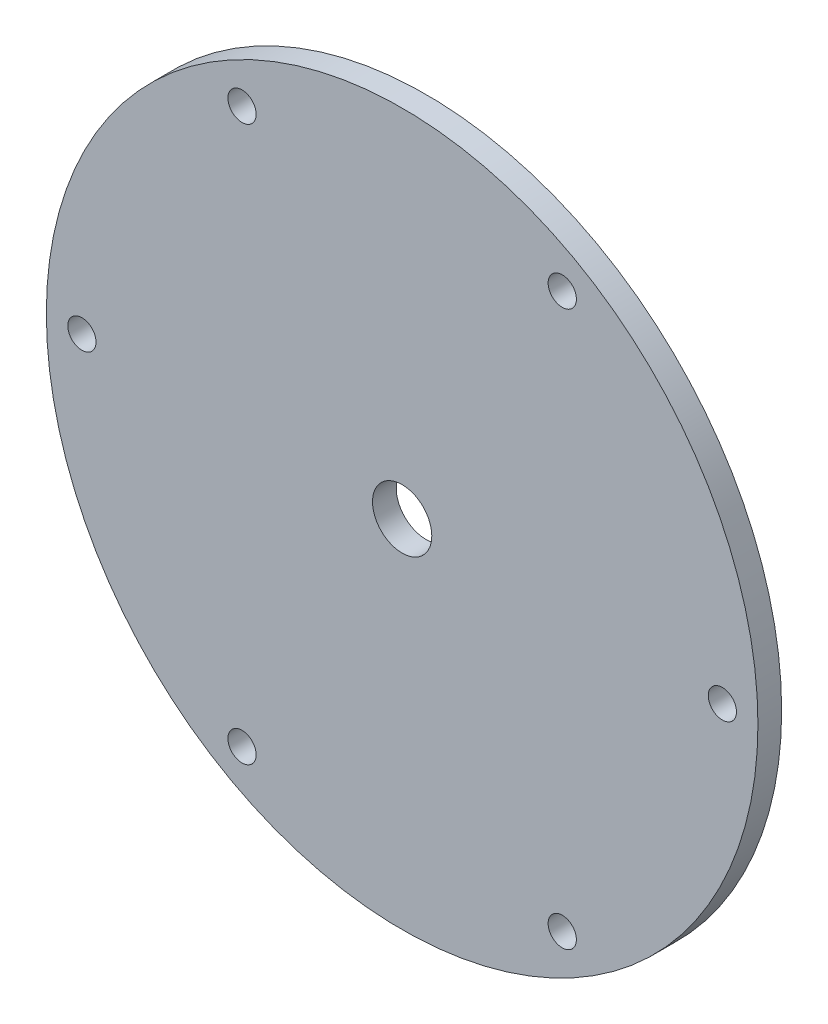
ISO-10303-21;
HEADER;
FILE_DESCRIPTION(('STEP AP214'),'2;1');
FILE_NAME('part.step','',(''),(''),'','','');
FILE_SCHEMA(('AUTOMOTIVE_DESIGN { 1 0 10303 214 1 1 1 1 }'));
ENDSEC;
DATA;
#1=APPLICATION_CONTEXT('core data for automotive mechanical design processes');
#2=APPLICATION_PROTOCOL_DEFINITION('international standard','automotive_design',2000,#1);
#3=PRODUCT_CONTEXT('',#1,'mechanical');
#4=PRODUCT('Part','Part','',(#3));
#5=PRODUCT_RELATED_PRODUCT_CATEGORY('part','',(#4));
#6=PRODUCT_DEFINITION_FORMATION('','',#4);
#7=PRODUCT_DEFINITION_CONTEXT('part definition',#1,'design');
#8=PRODUCT_DEFINITION('design','',#6,#7);
#9=PRODUCT_DEFINITION_SHAPE('','',#8);
#10=(LENGTH_UNIT() NAMED_UNIT(*) SI_UNIT(.MILLI.,.METRE.));
#11=(NAMED_UNIT(*) PLANE_ANGLE_UNIT() SI_UNIT($,.RADIAN.));
#12=(NAMED_UNIT(*) SI_UNIT($,.STERADIAN.) SOLID_ANGLE_UNIT());
#13=UNCERTAINTY_MEASURE_WITH_UNIT(LENGTH_MEASURE(1.E-05),#10,'distance_accuracy_value','');
#14=(GEOMETRIC_REPRESENTATION_CONTEXT(3) GLOBAL_UNCERTAINTY_ASSIGNED_CONTEXT((#13)) GLOBAL_UNIT_ASSIGNED_CONTEXT((#10,
#11,#12)) REPRESENTATION_CONTEXT('',''));
#15=CARTESIAN_POINT('',(0.,0.,0.));
#16=DIRECTION('',(0.,0.,1.));
#17=DIRECTION('',(1.,0.,0.));
#18=AXIS2_PLACEMENT_3D('',#15,#16,#17);
#19=CARTESIAN_POINT('',(0.,0.,4.));
#20=DIRECTION('',(0.,0.,1.));
#21=DIRECTION('',(1.,0.,0.));
#22=AXIS2_PLACEMENT_3D('',#19,#20,#21);
#23=PLANE('',#22);
#24=CARTESIAN_POINT('',(-54.,0.,4.));
#25=DIRECTION('',(0.,0.,1.));
#26=DIRECTION('',(1.,0.,0.));
#27=AXIS2_PLACEMENT_3D('',#24,#25,#26);
#28=CIRCLE('',#27,2.38125);
#29=CARTESIAN_POINT('',(-51.61875,0.,4.));
#30=VERTEX_POINT('',#29);
#31=EDGE_CURVE('E84',#30,#30,#28,.T.);
#32=ORIENTED_EDGE('',*,*,#31,.F.);
#33=EDGE_LOOP('',(#32));
#34=FACE_BOUND('',#33,.T.);
#35=CARTESIAN_POINT('',(54.,0.,4.));
#36=DIRECTION('',(0.,0.,1.));
#37=DIRECTION('',(1.,0.,0.));
#38=AXIS2_PLACEMENT_3D('',#35,#36,#37);
#39=CIRCLE('',#38,2.38125);
#40=CARTESIAN_POINT('',(56.38125,0.,4.));
#41=VERTEX_POINT('',#40);
#42=EDGE_CURVE('E78',#41,#41,#39,.T.);
#43=ORIENTED_EDGE('',*,*,#42,.F.);
#44=EDGE_LOOP('',(#43));
#45=FACE_BOUND('',#44,.T.);
#46=CARTESIAN_POINT('',(-26.9999999999999,46.7653718043597,4.));
#47=DIRECTION('',(0.,0.,1.));
#48=DIRECTION('',(1.,0.,0.));
#49=AXIS2_PLACEMENT_3D('',#46,#47,#48);
#50=CIRCLE('',#49,2.38125);
#51=CARTESIAN_POINT('',(-24.6187499999999,46.7653718043597,4.));
#52=VERTEX_POINT('',#51);
#53=EDGE_CURVE('E72',#52,#52,#50,.T.);
#54=ORIENTED_EDGE('',*,*,#53,.F.);
#55=EDGE_LOOP('',(#54));
#56=FACE_BOUND('',#55,.T.);
#57=CARTESIAN_POINT('',(-26.9999999999999,-46.7653718043598,4.));
#58=DIRECTION('',(0.,0.,1.));
#59=DIRECTION('',(1.,0.,0.));
#60=AXIS2_PLACEMENT_3D('',#57,#58,#59);
#61=CIRCLE('',#60,2.38125);
#62=CARTESIAN_POINT('',(-24.6187499999999,-46.7653718043598,4.));
#63=VERTEX_POINT('',#62);
#64=EDGE_CURVE('E66',#63,#63,#61,.T.);
#65=ORIENTED_EDGE('',*,*,#64,.F.);
#66=EDGE_LOOP('',(#65));
#67=FACE_BOUND('',#66,.T.);
#68=CARTESIAN_POINT('',(26.9999999999998,46.7653718043598,4.));
#69=DIRECTION('',(0.,0.,1.));
#70=DIRECTION('',(1.,0.,0.));
#71=AXIS2_PLACEMENT_3D('',#68,#69,#70);
#72=CIRCLE('',#71,2.38125);
#73=CARTESIAN_POINT('',(29.3812499999998,46.7653718043598,4.));
#74=VERTEX_POINT('',#73);
#75=EDGE_CURVE('E60',#74,#74,#72,.T.);
#76=ORIENTED_EDGE('',*,*,#75,.F.);
#77=EDGE_LOOP('',(#76));
#78=FACE_BOUND('',#77,.T.);
#79=CARTESIAN_POINT('',(26.9999999999998,-46.7653718043598,4.));
#80=DIRECTION('',(0.,0.,1.));
#81=DIRECTION('',(1.,0.,0.));
#82=AXIS2_PLACEMENT_3D('',#79,#80,#81);
#83=CIRCLE('',#82,2.38125);
#84=CARTESIAN_POINT('',(29.3812499999998,-46.7653718043598,4.));
#85=VERTEX_POINT('',#84);
#86=EDGE_CURVE('E54',#85,#85,#83,.T.);
#87=ORIENTED_EDGE('',*,*,#86,.F.);
#88=EDGE_LOOP('',(#87));
#89=FACE_BOUND('',#88,.T.);
#90=CARTESIAN_POINT('',(0.,0.,4.));
#91=DIRECTION('',(0.,0.,1.));
#92=DIRECTION('',(1.,0.,0.));
#93=AXIS2_PLACEMENT_3D('',#90,#91,#92);
#94=CIRCLE('',#93,60.);
#95=CARTESIAN_POINT('',(60.,0.,4.));
#96=VERTEX_POINT('',#95);
#97=EDGE_CURVE('E10',#96,#96,#94,.T.);
#98=ORIENTED_EDGE('',*,*,#97,.T.);
#99=EDGE_LOOP('',(#98));
#100=FACE_BOUND('',#99,.T.);
#101=CARTESIAN_POINT('',(0.,0.,4.));
#102=DIRECTION('',(0.,0.,1.));
#103=DIRECTION('',(1.,0.,0.));
#104=AXIS2_PLACEMENT_3D('',#101,#102,#103);
#105=CIRCLE('',#104,5.);
#106=CARTESIAN_POINT('',(5.,0.,4.));
#107=VERTEX_POINT('',#106);
#108=EDGE_CURVE('E44',#107,#107,#105,.T.);
#109=ORIENTED_EDGE('',*,*,#108,.F.);
#110=EDGE_LOOP('',(#109));
#111=FACE_BOUND('',#110,.T.);
#112=ADVANCED_FACE('F33',(#34,#45,#56,#67,#78,#89,#100,#111),#23,.T.);
#113=CARTESIAN_POINT('',(0.,0.,0.));
#114=DIRECTION('',(0.,0.,1.));
#115=DIRECTION('',(1.,0.,0.));
#116=AXIS2_PLACEMENT_3D('',#113,#114,#115);
#117=PLANE('',#116);
#118=CARTESIAN_POINT('',(-54.,0.,0.));
#119=DIRECTION('',(0.,0.,1.));
#120=DIRECTION('',(1.,0.,0.));
#121=AXIS2_PLACEMENT_3D('',#118,#119,#120);
#122=CIRCLE('',#121,2.38125);
#123=CARTESIAN_POINT('',(-51.61875,0.,0.));
#124=VERTEX_POINT('',#123);
#125=EDGE_CURVE('E81',#124,#124,#122,.T.);
#126=ORIENTED_EDGE('',*,*,#125,.T.);
#127=EDGE_LOOP('',(#126));
#128=FACE_BOUND('',#127,.T.);
#129=CARTESIAN_POINT('',(54.,0.,0.));
#130=DIRECTION('',(0.,0.,1.));
#131=DIRECTION('',(1.,0.,0.));
#132=AXIS2_PLACEMENT_3D('',#129,#130,#131);
#133=CIRCLE('',#132,2.38125);
#134=CARTESIAN_POINT('',(56.38125,0.,0.));
#135=VERTEX_POINT('',#134);
#136=EDGE_CURVE('E75',#135,#135,#133,.T.);
#137=ORIENTED_EDGE('',*,*,#136,.T.);
#138=EDGE_LOOP('',(#137));
#139=FACE_BOUND('',#138,.T.);
#140=CARTESIAN_POINT('',(-26.9999999999999,46.7653718043597,0.));
#141=DIRECTION('',(0.,0.,1.));
#142=DIRECTION('',(1.,0.,0.));
#143=AXIS2_PLACEMENT_3D('',#140,#141,#142);
#144=CIRCLE('',#143,2.38125);
#145=CARTESIAN_POINT('',(-24.6187499999999,46.7653718043597,0.));
#146=VERTEX_POINT('',#145);
#147=EDGE_CURVE('E69',#146,#146,#144,.T.);
#148=ORIENTED_EDGE('',*,*,#147,.T.);
#149=EDGE_LOOP('',(#148));
#150=FACE_BOUND('',#149,.T.);
#151=CARTESIAN_POINT('',(-26.9999999999999,-46.7653718043598,0.));
#152=DIRECTION('',(0.,0.,1.));
#153=DIRECTION('',(1.,0.,0.));
#154=AXIS2_PLACEMENT_3D('',#151,#152,#153);
#155=CIRCLE('',#154,2.38125);
#156=CARTESIAN_POINT('',(-24.6187499999999,-46.7653718043598,0.));
#157=VERTEX_POINT('',#156);
#158=EDGE_CURVE('E63',#157,#157,#155,.T.);
#159=ORIENTED_EDGE('',*,*,#158,.T.);
#160=EDGE_LOOP('',(#159));
#161=FACE_BOUND('',#160,.T.);
#162=CARTESIAN_POINT('',(26.9999999999998,46.7653718043598,0.));
#163=DIRECTION('',(0.,0.,1.));
#164=DIRECTION('',(1.,0.,0.));
#165=AXIS2_PLACEMENT_3D('',#162,#163,#164);
#166=CIRCLE('',#165,2.38125);
#167=CARTESIAN_POINT('',(29.3812499999998,46.7653718043598,0.));
#168=VERTEX_POINT('',#167);
#169=EDGE_CURVE('E57',#168,#168,#166,.T.);
#170=ORIENTED_EDGE('',*,*,#169,.T.);
#171=EDGE_LOOP('',(#170));
#172=FACE_BOUND('',#171,.T.);
#173=CARTESIAN_POINT('',(26.9999999999998,-46.7653718043598,0.));
#174=DIRECTION('',(0.,0.,1.));
#175=DIRECTION('',(1.,0.,0.));
#176=AXIS2_PLACEMENT_3D('',#173,#174,#175);
#177=CIRCLE('',#176,2.38125);
#178=CARTESIAN_POINT('',(29.3812499999998,-46.7653718043598,0.));
#179=VERTEX_POINT('',#178);
#180=EDGE_CURVE('E49',#179,#179,#177,.T.);
#181=ORIENTED_EDGE('',*,*,#180,.T.);
#182=EDGE_LOOP('',(#181));
#183=FACE_BOUND('',#182,.T.);
#184=CARTESIAN_POINT('',(0.,0.,0.));
#185=DIRECTION('',(0.,0.,1.));
#186=DIRECTION('',(1.,0.,0.));
#187=AXIS2_PLACEMENT_3D('',#184,#185,#186);
#188=CIRCLE('',#187,60.);
#189=CARTESIAN_POINT('',(60.,0.,0.));
#190=VERTEX_POINT('',#189);
#191=EDGE_CURVE('E37',#190,#190,#188,.T.);
#192=ORIENTED_EDGE('',*,*,#191,.F.);
#193=EDGE_LOOP('',(#192));
#194=FACE_BOUND('',#193,.T.);
#195=CARTESIAN_POINT('',(0.,0.,0.));
#196=DIRECTION('',(0.,0.,1.));
#197=DIRECTION('',(1.,0.,0.));
#198=AXIS2_PLACEMENT_3D('',#195,#196,#197);
#199=CIRCLE('',#198,5.);
#200=CARTESIAN_POINT('',(5.,0.,0.));
#201=VERTEX_POINT('',#200);
#202=EDGE_CURVE('E46',#201,#201,#199,.T.);
#203=ORIENTED_EDGE('',*,*,#202,.T.);
#204=EDGE_LOOP('',(#203));
#205=FACE_BOUND('',#204,.T.);
#206=ADVANCED_FACE('F92',(#128,#139,#150,#161,#172,#183,#194,#205),#117,.F.);
#207=CARTESIAN_POINT('',(0.,0.,4.));
#208=DIRECTION('',(0.,0.,-1.));
#209=DIRECTION('',(-1.,0.,0.));
#210=AXIS2_PLACEMENT_3D('',#207,#208,#209);
#211=CYLINDRICAL_SURFACE('',#210,60.);
#212=ORIENTED_EDGE('',*,*,#97,.F.);
#213=EDGE_LOOP('',(#212));
#214=FACE_BOUND('',#213,.T.);
#215=ORIENTED_EDGE('',*,*,#191,.T.);
#216=EDGE_LOOP('',(#215));
#217=FACE_BOUND('',#216,.T.);
#218=ADVANCED_FACE('F35',(#214,#217),#211,.T.);
#219=CARTESIAN_POINT('',(0.,0.,4.));
#220=DIRECTION('',(0.,0.,-1.));
#221=DIRECTION('',(-1.,0.,0.));
#222=AXIS2_PLACEMENT_3D('',#219,#220,#221);
#223=CYLINDRICAL_SURFACE('',#222,5.);
#224=ORIENTED_EDGE('',*,*,#108,.T.);
#225=EDGE_LOOP('',(#224));
#226=FACE_BOUND('',#225,.T.);
#227=ORIENTED_EDGE('',*,*,#202,.F.);
#228=EDGE_LOOP('',(#227));
#229=FACE_BOUND('',#228,.T.);
#230=ADVANCED_FACE('F106',(#226,#229),#223,.F.);
#231=CARTESIAN_POINT('',(26.9999999999998,-46.7653718043598,4.));
#232=DIRECTION('',(0.,0.,1.));
#233=DIRECTION('',(1.,0.,0.));
#234=AXIS2_PLACEMENT_3D('',#231,#232,#233);
#235=CYLINDRICAL_SURFACE('',#234,2.38125);
#236=ORIENTED_EDGE('',*,*,#180,.F.);
#237=EDGE_LOOP('',(#236));
#238=FACE_BOUND('',#237,.T.);
#239=ORIENTED_EDGE('',*,*,#86,.T.);
#240=EDGE_LOOP('',(#239));
#241=FACE_BOUND('',#240,.T.);
#242=ADVANCED_FACE('F109',(#238,#241),#235,.F.);
#243=CARTESIAN_POINT('',(26.9999999999998,46.7653718043598,4.));
#244=DIRECTION('',(0.,0.,1.));
#245=DIRECTION('',(1.,0.,0.));
#246=AXIS2_PLACEMENT_3D('',#243,#244,#245);
#247=CYLINDRICAL_SURFACE('',#246,2.38125);
#248=ORIENTED_EDGE('',*,*,#169,.F.);
#249=EDGE_LOOP('',(#248));
#250=FACE_BOUND('',#249,.T.);
#251=ORIENTED_EDGE('',*,*,#75,.T.);
#252=EDGE_LOOP('',(#251));
#253=FACE_BOUND('',#252,.T.);
#254=ADVANCED_FACE('F123',(#250,#253),#247,.F.);
#255=CARTESIAN_POINT('',(-26.9999999999999,-46.7653718043598,4.));
#256=DIRECTION('',(0.,0.,1.));
#257=DIRECTION('',(1.,0.,0.));
#258=AXIS2_PLACEMENT_3D('',#255,#256,#257);
#259=CYLINDRICAL_SURFACE('',#258,2.38125);
#260=ORIENTED_EDGE('',*,*,#158,.F.);
#261=EDGE_LOOP('',(#260));
#262=FACE_BOUND('',#261,.T.);
#263=ORIENTED_EDGE('',*,*,#64,.T.);
#264=EDGE_LOOP('',(#263));
#265=FACE_BOUND('',#264,.T.);
#266=ADVANCED_FACE('F127',(#262,#265),#259,.F.);
#267=CARTESIAN_POINT('',(-26.9999999999999,46.7653718043597,4.));
#268=DIRECTION('',(0.,0.,1.));
#269=DIRECTION('',(1.,0.,0.));
#270=AXIS2_PLACEMENT_3D('',#267,#268,#269);
#271=CYLINDRICAL_SURFACE('',#270,2.38125);
#272=ORIENTED_EDGE('',*,*,#147,.F.);
#273=EDGE_LOOP('',(#272));
#274=FACE_BOUND('',#273,.T.);
#275=ORIENTED_EDGE('',*,*,#53,.T.);
#276=EDGE_LOOP('',(#275));
#277=FACE_BOUND('',#276,.T.);
#278=ADVANCED_FACE('F131',(#274,#277),#271,.F.);
#279=CARTESIAN_POINT('',(54.,0.,4.));
#280=DIRECTION('',(0.,0.,1.));
#281=DIRECTION('',(1.,0.,0.));
#282=AXIS2_PLACEMENT_3D('',#279,#280,#281);
#283=CYLINDRICAL_SURFACE('',#282,2.38125);
#284=ORIENTED_EDGE('',*,*,#136,.F.);
#285=EDGE_LOOP('',(#284));
#286=FACE_BOUND('',#285,.T.);
#287=ORIENTED_EDGE('',*,*,#42,.T.);
#288=EDGE_LOOP('',(#287));
#289=FACE_BOUND('',#288,.T.);
#290=ADVANCED_FACE('F135',(#286,#289),#283,.F.);
#291=CARTESIAN_POINT('',(-54.,0.,4.));
#292=DIRECTION('',(0.,0.,1.));
#293=DIRECTION('',(1.,0.,0.));
#294=AXIS2_PLACEMENT_3D('',#291,#292,#293);
#295=CYLINDRICAL_SURFACE('',#294,2.38125);
#296=ORIENTED_EDGE('',*,*,#125,.F.);
#297=EDGE_LOOP('',(#296));
#298=FACE_BOUND('',#297,.T.);
#299=ORIENTED_EDGE('',*,*,#31,.T.);
#300=EDGE_LOOP('',(#299));
#301=FACE_BOUND('',#300,.T.);
#302=ADVANCED_FACE('F88',(#298,#301),#295,.F.);
#303=CLOSED_SHELL('',(#112,#206,#218,#230,#242,#254,#266,#278,#290,#302));
#304=MANIFOLD_SOLID_BREP('B2',#303);
#305=ADVANCED_BREP_SHAPE_REPRESENTATION('',(#18,#304),#14);
#306=SHAPE_DEFINITION_REPRESENTATION(#9,#305);
ENDSEC;
END-ISO-10303-21;
